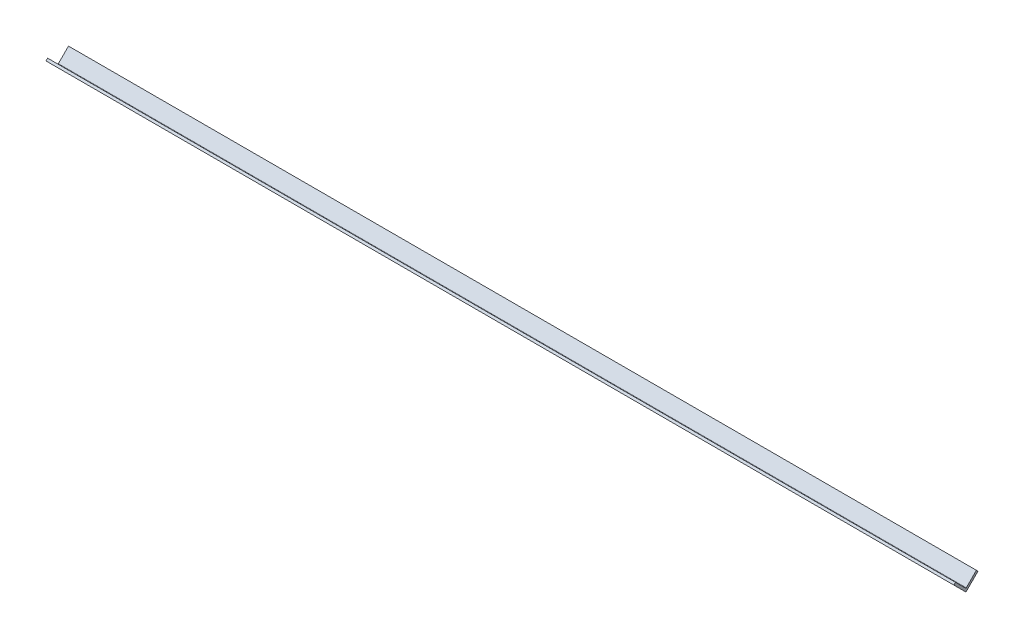
ISO-10303-21;
HEADER;
FILE_DESCRIPTION(('STEP AP214'),'2;1');
FILE_NAME('part.step','',(''),(''),'','','');
FILE_SCHEMA(('AUTOMOTIVE_DESIGN { 1 0 10303 214 1 1 1 1 }'));
ENDSEC;
DATA;
#1=APPLICATION_CONTEXT('core data for automotive mechanical design processes');
#2=APPLICATION_PROTOCOL_DEFINITION('international standard','automotive_design',2000,#1);
#3=PRODUCT_CONTEXT('',#1,'mechanical');
#4=PRODUCT('Part','Part','',(#3));
#5=PRODUCT_RELATED_PRODUCT_CATEGORY('part','',(#4));
#6=PRODUCT_DEFINITION_FORMATION('','',#4);
#7=PRODUCT_DEFINITION_CONTEXT('part definition',#1,'design');
#8=PRODUCT_DEFINITION('design','',#6,#7);
#9=PRODUCT_DEFINITION_SHAPE('','',#8);
#10=(LENGTH_UNIT() NAMED_UNIT(*) SI_UNIT(.MILLI.,.METRE.));
#11=(NAMED_UNIT(*) PLANE_ANGLE_UNIT() SI_UNIT($,.RADIAN.));
#12=(NAMED_UNIT(*) SI_UNIT($,.STERADIAN.) SOLID_ANGLE_UNIT());
#13=UNCERTAINTY_MEASURE_WITH_UNIT(LENGTH_MEASURE(1.E-05),#10,'distance_accuracy_value','');
#14=(GEOMETRIC_REPRESENTATION_CONTEXT(3) GLOBAL_UNCERTAINTY_ASSIGNED_CONTEXT((#13)) GLOBAL_UNIT_ASSIGNED_CONTEXT((#10,
#11,#12)) REPRESENTATION_CONTEXT('',''));
#15=CARTESIAN_POINT('',(0.,0.,0.));
#16=DIRECTION('',(0.,0.,1.));
#17=DIRECTION('',(1.,0.,0.));
#18=AXIS2_PLACEMENT_3D('',#15,#16,#17);
#19=CARTESIAN_POINT('',(1012.,13.4350288425445,-13.4350288425443));
#20=DIRECTION('',(0.,-0.707106781186551,0.707106781186544));
#21=DIRECTION('',(0.,-0.707106781186544,-0.707106781186551));
#22=AXIS2_PLACEMENT_3D('',#19,#20,#21);
#23=PLANE('',#22);
#24=DIRECTION('',(0.,0.707106781186544,0.707106781186551));
#25=VECTOR('',#24,1.);
#26=CARTESIAN_POINT('',(0.,13.4350288425445,-13.4350288425443));
#27=LINE('',#26,#25);
#28=CARTESIAN_POINT('',(0.,13.4350288425445,-13.4350288425443));
#29=VERTEX_POINT('',#28);
#30=CARTESIAN_POINT('',(0.,15.2310800667583,-11.6389776183305));
#31=VERTEX_POINT('',#30);
#32=EDGE_CURVE('E129',#29,#31,#27,.T.);
#33=ORIENTED_EDGE('',*,*,#32,.T.);
#34=DIRECTION('',(-1.,0.,0.));
#35=VECTOR('',#34,1.);
#36=CARTESIAN_POINT('',(1012.,15.2310800667583,-11.6389776183305));
#37=LINE('',#36,#35);
#38=CARTESIAN_POINT('',(1012.,15.2310800667583,-11.6389776183305));
#39=VERTEX_POINT('',#38);
#40=EDGE_CURVE('E11',#39,#31,#37,.T.);
#41=ORIENTED_EDGE('',*,*,#40,.F.);
#42=DIRECTION('',(0.,0.707106781186544,0.707106781186551));
#43=VECTOR('',#42,1.);
#44=CARTESIAN_POINT('',(1012.,13.4350288425445,-13.4350288425443));
#45=LINE('',#44,#43);
#46=CARTESIAN_POINT('',(1012.,13.4350288425445,-13.4350288425443));
#47=VERTEX_POINT('',#46);
#48=EDGE_CURVE('E143',#47,#39,#45,.T.);
#49=ORIENTED_EDGE('',*,*,#48,.F.);
#50=DIRECTION('',(-1.,0.,0.));
#51=VECTOR('',#50,1.);
#52=CARTESIAN_POINT('',(1012.,13.4350288425445,-13.4350288425443));
#53=LINE('',#52,#51);
#54=EDGE_CURVE('E125',#47,#29,#53,.T.);
#55=ORIENTED_EDGE('',*,*,#54,.T.);
#56=EDGE_LOOP('',(#33,#41,#49,#55));
#57=FACE_BOUND('',#56,.T.);
#58=ADVANCED_FACE('F33',(#57),#23,.F.);
#59=CARTESIAN_POINT('',(1012.,15.2310800667583,-11.6389776183305));
#60=DIRECTION('',(0.,-0.707106781186544,-0.707106781186551));
#61=DIRECTION('',(0.,0.707106781186551,-0.707106781186544));
#62=AXIS2_PLACEMENT_3D('',#59,#60,#61);
#63=PLANE('',#62);
#64=DIRECTION('',(0.,-0.707106781186551,0.707106781186544));
#65=VECTOR('',#64,1.);
#66=CARTESIAN_POINT('',(0.,15.2310800667583,-11.6389776183305));
#67=LINE('',#66,#65);
#68=CARTESIAN_POINT('',(0.,3.94565583902096,-0.353553390593278));
#69=VERTEX_POINT('',#68);
#70=EDGE_CURVE('E132',#31,#69,#67,.T.);
#71=ORIENTED_EDGE('',*,*,#70,.T.);
#72=DIRECTION('',(-1.,0.,0.));
#73=VECTOR('',#72,1.);
#74=CARTESIAN_POINT('',(1012.,3.94565583902096,-0.353553390593278));
#75=LINE('',#74,#73);
#76=CARTESIAN_POINT('',(1012.,3.94565583902096,-0.353553390593278));
#77=VERTEX_POINT('',#76);
#78=EDGE_CURVE('E41',#77,#69,#75,.T.);
#79=ORIENTED_EDGE('',*,*,#78,.F.);
#80=DIRECTION('',(0.,-0.707106781186551,0.707106781186544));
#81=VECTOR('',#80,1.);
#82=CARTESIAN_POINT('',(1012.,15.2310800667583,-11.6389776183305));
#83=LINE('',#82,#81);
#84=EDGE_CURVE('E92',#39,#77,#83,.T.);
#85=ORIENTED_EDGE('',*,*,#84,.F.);
#86=ORIENTED_EDGE('',*,*,#40,.T.);
#87=EDGE_LOOP('',(#71,#79,#85,#86));
#88=FACE_BOUND('',#87,.T.);
#89=ADVANCED_FACE('F178',(#88),#63,.F.);
#90=CARTESIAN_POINT('',(1012.,4.29920922961423,0.));
#91=DIRECTION('',(-1.,0.,0.));
#92=DIRECTION('',(0.,0.,1.));
#93=AXIS2_PLACEMENT_3D('',#90,#91,#92);
#94=CYLINDRICAL_SURFACE('',#93,0.499999999999999);
#95=CARTESIAN_POINT('',(0.,4.29920922961423,0.));
#96=DIRECTION('',(-1.,0.,0.));
#97=DIRECTION('',(0.,0.,-1.));
#98=AXIS2_PLACEMENT_3D('',#95,#96,#97);
#99=CIRCLE('',#98,0.499999999999999);
#100=CARTESIAN_POINT('',(0.,3.94565583902096,0.353553390593278));
#101=VERTEX_POINT('',#100);
#102=EDGE_CURVE('E134',#69,#101,#99,.T.);
#103=ORIENTED_EDGE('',*,*,#102,.T.);
#104=DIRECTION('',(-1.,0.,0.));
#105=VECTOR('',#104,1.);
#106=CARTESIAN_POINT('',(1012.,3.94565583902096,0.353553390593278));
#107=LINE('',#106,#105);
#108=CARTESIAN_POINT('',(1012.,3.94565583902096,0.353553390593278));
#109=VERTEX_POINT('',#108);
#110=EDGE_CURVE('E150',#109,#101,#107,.T.);
#111=ORIENTED_EDGE('',*,*,#110,.F.);
#112=CARTESIAN_POINT('',(1012.,4.29920922961423,0.));
#113=DIRECTION('',(-1.,0.,0.));
#114=DIRECTION('',(0.,0.,-1.));
#115=AXIS2_PLACEMENT_3D('',#112,#113,#114);
#116=CIRCLE('',#115,0.499999999999999);
#117=EDGE_CURVE('E158',#77,#109,#116,.T.);
#118=ORIENTED_EDGE('',*,*,#117,.F.);
#119=ORIENTED_EDGE('',*,*,#78,.T.);
#120=EDGE_LOOP('',(#103,#111,#118,#119));
#121=FACE_BOUND('',#120,.T.);
#122=ADVANCED_FACE('F156',(#121),#94,.F.);
#123=CARTESIAN_POINT('',(1012.,15.2310800667583,11.6389776183305));
#124=DIRECTION('',(0.,-0.707106781186544,0.707106781186551));
#125=DIRECTION('',(0.,-0.707106781186551,-0.707106781186544));
#126=AXIS2_PLACEMENT_3D('',#123,#124,#125);
#127=PLANE('',#126);
#128=DIRECTION('',(0.,0.707106781186551,0.707106781186544));
#129=VECTOR('',#128,1.);
#130=CARTESIAN_POINT('',(0.,15.2310800667583,11.6389776183305));
#131=LINE('',#130,#129);
#132=CARTESIAN_POINT('',(0.,15.2310800667583,11.6389776183305));
#133=VERTEX_POINT('',#132);
#134=EDGE_CURVE('E136',#101,#133,#131,.T.);
#135=ORIENTED_EDGE('',*,*,#134,.T.);
#136=DIRECTION('',(-1.,0.,0.));
#137=VECTOR('',#136,1.);
#138=CARTESIAN_POINT('',(1012.,15.2310800667583,11.6389776183305));
#139=LINE('',#138,#137);
#140=CARTESIAN_POINT('',(1012.,15.2310800667583,11.6389776183305));
#141=VERTEX_POINT('',#140);
#142=EDGE_CURVE('E147',#141,#133,#139,.T.);
#143=ORIENTED_EDGE('',*,*,#142,.F.);
#144=DIRECTION('',(0.,0.707106781186551,0.707106781186544));
#145=VECTOR('',#144,1.);
#146=CARTESIAN_POINT('',(1012.,15.2310800667583,11.6389776183305));
#147=LINE('',#146,#145);
#148=EDGE_CURVE('E170',#109,#141,#147,.T.);
#149=ORIENTED_EDGE('',*,*,#148,.F.);
#150=ORIENTED_EDGE('',*,*,#110,.T.);
#151=EDGE_LOOP('',(#135,#143,#149,#150));
#152=FACE_BOUND('',#151,.T.);
#153=ADVANCED_FACE('F166',(#152),#127,.F.);
#154=CARTESIAN_POINT('',(1012.,13.4350288425445,13.4350288425443));
#155=DIRECTION('',(0.,-0.707106781186551,-0.707106781186544));
#156=DIRECTION('',(0.,0.707106781186544,-0.707106781186551));
#157=AXIS2_PLACEMENT_3D('',#154,#155,#156);
#158=PLANE('',#157);
#159=DIRECTION('',(0.,-0.707106781186544,0.707106781186551));
#160=VECTOR('',#159,1.);
#161=CARTESIAN_POINT('',(0.,13.4350288425445,13.4350288425443));
#162=LINE('',#161,#160);
#163=CARTESIAN_POINT('',(0.,13.4350288425445,13.4350288425443));
#164=VERTEX_POINT('',#163);
#165=EDGE_CURVE('E138',#133,#164,#162,.T.);
#166=ORIENTED_EDGE('',*,*,#165,.T.);
#167=DIRECTION('',(-1.,0.,0.));
#168=VECTOR('',#167,1.);
#169=CARTESIAN_POINT('',(1012.,13.4350288425445,13.4350288425443));
#170=LINE('',#169,#168);
#171=CARTESIAN_POINT('',(1012.,13.4350288425445,13.4350288425443));
#172=VERTEX_POINT('',#171);
#173=EDGE_CURVE('E120',#172,#164,#170,.T.);
#174=ORIENTED_EDGE('',*,*,#173,.F.);
#175=DIRECTION('',(0.,-0.707106781186544,0.707106781186551));
#176=VECTOR('',#175,1.);
#177=CARTESIAN_POINT('',(1012.,13.4350288425445,13.4350288425443));
#178=LINE('',#177,#176);
#179=EDGE_CURVE('E111',#141,#172,#178,.T.);
#180=ORIENTED_EDGE('',*,*,#179,.F.);
#181=ORIENTED_EDGE('',*,*,#142,.T.);
#182=EDGE_LOOP('',(#166,#174,#180,#181));
#183=FACE_BOUND('',#182,.T.);
#184=ADVANCED_FACE('F169',(#183),#158,.F.);
#185=CARTESIAN_POINT('',(1012.,0.35355339059328,0.353553390593276));
#186=DIRECTION('',(0.,0.707106781186544,-0.707106781186551));
#187=DIRECTION('',(0.,0.707106781186551,0.707106781186544));
#188=AXIS2_PLACEMENT_3D('',#185,#186,#187);
#189=PLANE('',#188);
#190=DIRECTION('',(0.,-0.707106781186551,-0.707106781186544));
#191=VECTOR('',#190,1.);
#192=CARTESIAN_POINT('',(0.,0.35355339059328,0.353553390593276));
#193=LINE('',#192,#191);
#194=CARTESIAN_POINT('',(0.,0.35355339059328,0.353553390593276));
#195=VERTEX_POINT('',#194);
#196=EDGE_CURVE('E119',#164,#195,#193,.T.);
#197=ORIENTED_EDGE('',*,*,#196,.T.);
#198=DIRECTION('',(-1.,0.,0.));
#199=VECTOR('',#198,1.);
#200=CARTESIAN_POINT('',(1012.,0.35355339059328,0.353553390593276));
#201=LINE('',#200,#199);
#202=CARTESIAN_POINT('',(1012.,0.35355339059328,0.353553390593276));
#203=VERTEX_POINT('',#202);
#204=EDGE_CURVE('E116',#203,#195,#201,.T.);
#205=ORIENTED_EDGE('',*,*,#204,.F.);
#206=DIRECTION('',(0.,-0.707106781186551,-0.707106781186544));
#207=VECTOR('',#206,1.);
#208=CARTESIAN_POINT('',(1012.,0.35355339059328,0.353553390593276));
#209=LINE('',#208,#207);
#210=EDGE_CURVE('E105',#172,#203,#209,.T.);
#211=ORIENTED_EDGE('',*,*,#210,.F.);
#212=ORIENTED_EDGE('',*,*,#173,.T.);
#213=EDGE_LOOP('',(#197,#205,#211,#212));
#214=FACE_BOUND('',#213,.T.);
#215=ADVANCED_FACE('F117',(#214),#189,.F.);
#216=CARTESIAN_POINT('',(1012.,0.707106781186551,0.));
#217=DIRECTION('',(-1.,0.,0.));
#218=DIRECTION('',(0.,0.,1.));
#219=AXIS2_PLACEMENT_3D('',#216,#217,#218);
#220=CYLINDRICAL_SURFACE('',#219,0.5);
#221=CARTESIAN_POINT('',(0.,0.707106781186551,0.));
#222=DIRECTION('',(1.,0.,0.));
#223=DIRECTION('',(0.,0.,-1.));
#224=AXIS2_PLACEMENT_3D('',#221,#222,#223);
#225=CIRCLE('',#224,0.5);
#226=CARTESIAN_POINT('',(0.,0.353553390593282,-0.353553390593278));
#227=VERTEX_POINT('',#226);
#228=EDGE_CURVE('E78',#195,#227,#225,.T.);
#229=ORIENTED_EDGE('',*,*,#228,.T.);
#230=DIRECTION('',(-1.,0.,0.));
#231=VECTOR('',#230,1.);
#232=CARTESIAN_POINT('',(1012.,0.353553390593282,-0.353553390593278));
#233=LINE('',#232,#231);
#234=CARTESIAN_POINT('',(1012.,0.353553390593282,-0.353553390593278));
#235=VERTEX_POINT('',#234);
#236=EDGE_CURVE('E121',#235,#227,#233,.T.);
#237=ORIENTED_EDGE('',*,*,#236,.F.);
#238=CARTESIAN_POINT('',(1012.,0.707106781186551,0.));
#239=DIRECTION('',(1.,0.,0.));
#240=DIRECTION('',(0.,0.,-1.));
#241=AXIS2_PLACEMENT_3D('',#238,#239,#240);
#242=CIRCLE('',#241,0.5);
#243=EDGE_CURVE('E109',#203,#235,#242,.T.);
#244=ORIENTED_EDGE('',*,*,#243,.F.);
#245=ORIENTED_EDGE('',*,*,#204,.T.);
#246=EDGE_LOOP('',(#229,#237,#244,#245));
#247=FACE_BOUND('',#246,.T.);
#248=ADVANCED_FACE('F123',(#247),#220,.T.);
#249=CARTESIAN_POINT('',(1012.,0.353553390593282,-0.353553390593278));
#250=DIRECTION('',(0.,0.707106781186544,0.707106781186551));
#251=DIRECTION('',(0.,-0.707106781186551,0.707106781186544));
#252=AXIS2_PLACEMENT_3D('',#249,#250,#251);
#253=PLANE('',#252);
#254=DIRECTION('',(0.,0.707106781186551,-0.707106781186544));
#255=VECTOR('',#254,1.);
#256=CARTESIAN_POINT('',(0.,0.353553390593282,-0.353553390593278));
#257=LINE('',#256,#255);
#258=EDGE_CURVE('E84',#227,#29,#257,.T.);
#259=ORIENTED_EDGE('',*,*,#258,.T.);
#260=ORIENTED_EDGE('',*,*,#54,.F.);
#261=DIRECTION('',(0.,0.707106781186551,-0.707106781186544));
#262=VECTOR('',#261,1.);
#263=CARTESIAN_POINT('',(1012.,0.353553390593282,-0.353553390593278));
#264=LINE('',#263,#262);
#265=EDGE_CURVE('E49',#235,#47,#264,.T.);
#266=ORIENTED_EDGE('',*,*,#265,.F.);
#267=ORIENTED_EDGE('',*,*,#236,.T.);
#268=EDGE_LOOP('',(#259,#260,#266,#267));
#269=FACE_BOUND('',#268,.T.);
#270=ADVANCED_FACE('F194',(#269),#253,.F.);
#271=CARTESIAN_POINT('',(1012.,4.29920922961423,0.));
#272=DIRECTION('',(1.,0.,0.));
#273=DIRECTION('',(0.,0.,-1.));
#274=AXIS2_PLACEMENT_3D('',#271,#272,#273);
#275=PLANE('',#274);
#276=ORIENTED_EDGE('',*,*,#48,.T.);
#277=ORIENTED_EDGE('',*,*,#84,.T.);
#278=ORIENTED_EDGE('',*,*,#117,.T.);
#279=ORIENTED_EDGE('',*,*,#148,.T.);
#280=ORIENTED_EDGE('',*,*,#179,.T.);
#281=ORIENTED_EDGE('',*,*,#210,.T.);
#282=ORIENTED_EDGE('',*,*,#243,.T.);
#283=ORIENTED_EDGE('',*,*,#265,.T.);
#284=EDGE_LOOP('',(#276,#277,#278,#279,#280,#281,#282,#283));
#285=FACE_BOUND('',#284,.T.);
#286=ADVANCED_FACE('F107',(#285),#275,.T.);
#287=CARTESIAN_POINT('',(0.,4.29920922961423,0.));
#288=DIRECTION('',(1.,0.,0.));
#289=DIRECTION('',(0.,0.,-1.));
#290=AXIS2_PLACEMENT_3D('',#287,#288,#289);
#291=PLANE('',#290);
#292=ORIENTED_EDGE('',*,*,#32,.F.);
#293=ORIENTED_EDGE('',*,*,#258,.F.);
#294=ORIENTED_EDGE('',*,*,#228,.F.);
#295=ORIENTED_EDGE('',*,*,#196,.F.);
#296=ORIENTED_EDGE('',*,*,#165,.F.);
#297=ORIENTED_EDGE('',*,*,#134,.F.);
#298=ORIENTED_EDGE('',*,*,#102,.F.);
#299=ORIENTED_EDGE('',*,*,#70,.F.);
#300=EDGE_LOOP('',(#292,#293,#294,#295,#296,#297,#298,#299));
#301=FACE_BOUND('',#300,.T.);
#302=ADVANCED_FACE('F162',(#301),#291,.F.);
#303=CLOSED_SHELL('',(#58,#89,#122,#153,#184,#215,#248,#270,#286,#302));
#304=MANIFOLD_SOLID_BREP('B2',#303);
#305=ADVANCED_BREP_SHAPE_REPRESENTATION('',(#18,#304),#14);
#306=SHAPE_DEFINITION_REPRESENTATION(#9,#305);
ENDSEC;
END-ISO-10303-21;
